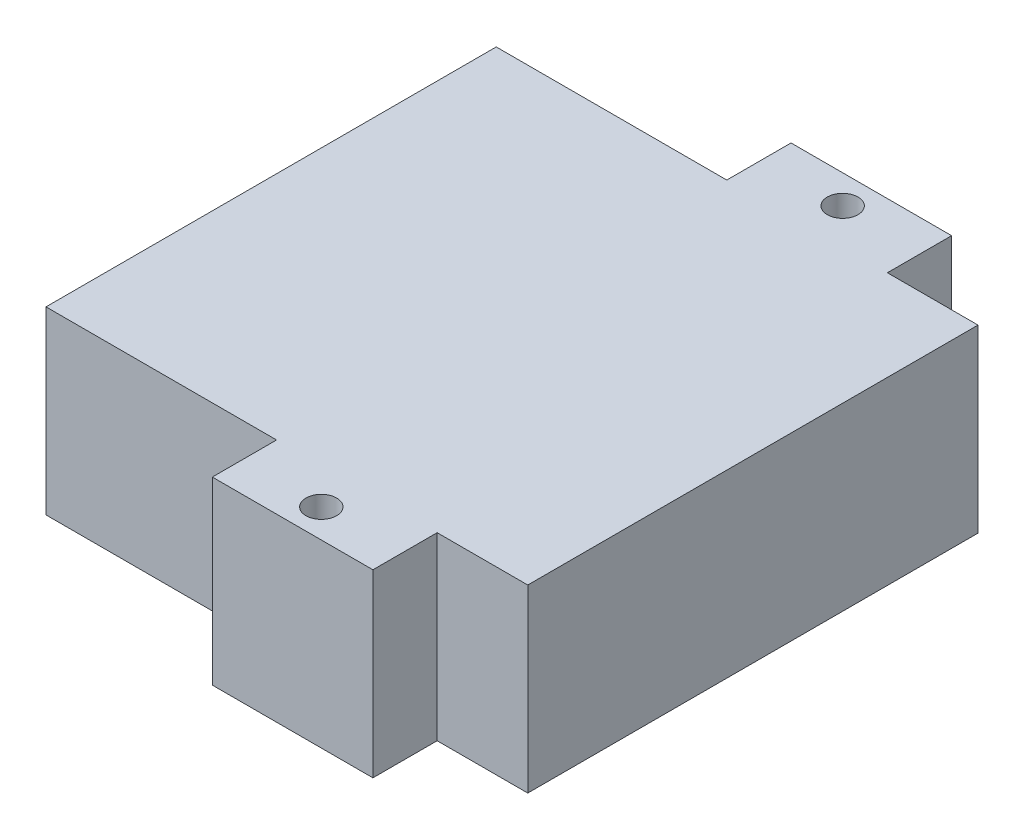
ISO-10303-21;
HEADER;
FILE_DESCRIPTION(('STEP AP214'),'2;1');
FILE_NAME('part.step','',(''),(''),'','','');
FILE_SCHEMA(('AUTOMOTIVE_DESIGN { 1 0 10303 214 1 1 1 1 }'));
ENDSEC;
DATA;
#1=APPLICATION_CONTEXT('core data for automotive mechanical design processes');
#2=APPLICATION_PROTOCOL_DEFINITION('international standard','automotive_design',2000,#1);
#3=PRODUCT_CONTEXT('',#1,'mechanical');
#4=PRODUCT('Part','Part','',(#3));
#5=PRODUCT_RELATED_PRODUCT_CATEGORY('part','',(#4));
#6=PRODUCT_DEFINITION_FORMATION('','',#4);
#7=PRODUCT_DEFINITION_CONTEXT('part definition',#1,'design');
#8=PRODUCT_DEFINITION('design','',#6,#7);
#9=PRODUCT_DEFINITION_SHAPE('','',#8);
#10=(LENGTH_UNIT() NAMED_UNIT(*) SI_UNIT(.MILLI.,.METRE.));
#11=(NAMED_UNIT(*) PLANE_ANGLE_UNIT() SI_UNIT($,.RADIAN.));
#12=(NAMED_UNIT(*) SI_UNIT($,.STERADIAN.) SOLID_ANGLE_UNIT());
#13=UNCERTAINTY_MEASURE_WITH_UNIT(LENGTH_MEASURE(1.E-05),#10,'distance_accuracy_value','');
#14=(GEOMETRIC_REPRESENTATION_CONTEXT(3) GLOBAL_UNCERTAINTY_ASSIGNED_CONTEXT((#13)) GLOBAL_UNIT_ASSIGNED_CONTEXT((#10,
#11,#12)) REPRESENTATION_CONTEXT('',''));
#15=CARTESIAN_POINT('',(0.,0.,0.));
#16=DIRECTION('',(0.,0.,1.));
#17=DIRECTION('',(1.,0.,0.));
#18=AXIS2_PLACEMENT_3D('',#15,#16,#17);
#19=CARTESIAN_POINT('',(0.,0.,0.));
#20=DIRECTION('',(0.,-1.,0.));
#21=DIRECTION('',(0.,0.,-1.));
#22=AXIS2_PLACEMENT_3D('',#19,#20,#21);
#23=PLANE('',#22);
#24=CARTESIAN_POINT('',(7.747,0.,-28.86075));
#25=DIRECTION('',(0.,1.,0.));
#26=DIRECTION('',(0.,0.,1.));
#27=AXIS2_PLACEMENT_3D('',#24,#25,#26);
#28=CIRCLE('',#27,1.69999999999999);
#29=CARTESIAN_POINT('',(7.747,0.,-27.16075));
#30=VERTEX_POINT('',#29);
#31=EDGE_CURVE('E280',#30,#30,#28,.T.);
#32=ORIENTED_EDGE('',*,*,#31,.T.);
#33=EDGE_LOOP('',(#32));
#34=FACE_BOUND('',#33,.T.);
#35=DIRECTION('',(0.,0.,-1.));
#36=VECTOR('',#35,1.);
#37=CARTESIAN_POINT('',(26.67,0.,24.92375));
#38=LINE('',#37,#36);
#39=CARTESIAN_POINT('',(26.67,0.,24.92375));
#40=VERTEX_POINT('',#39);
#41=CARTESIAN_POINT('',(26.67,0.,-24.92375));
#42=VERTEX_POINT('',#41);
#43=EDGE_CURVE('E160',#40,#42,#38,.T.);
#44=ORIENTED_EDGE('',*,*,#43,.F.);
#45=DIRECTION('',(1.,0.,0.));
#46=VECTOR('',#45,1.);
#47=CARTESIAN_POINT('',(16.637,0.,24.92375));
#48=LINE('',#47,#46);
#49=CARTESIAN_POINT('',(16.637,0.,24.92375));
#50=VERTEX_POINT('',#49);
#51=EDGE_CURVE('E103',#50,#40,#48,.T.);
#52=ORIENTED_EDGE('',*,*,#51,.F.);
#53=DIRECTION('',(0.,0.,-1.));
#54=VECTOR('',#53,1.);
#55=CARTESIAN_POINT('',(16.637,0.,24.92375));
#56=LINE('',#55,#54);
#57=CARTESIAN_POINT('',(16.637,0.,32.03575));
#58=VERTEX_POINT('',#57);
#59=EDGE_CURVE('E97',#58,#50,#56,.T.);
#60=ORIENTED_EDGE('',*,*,#59,.F.);
#61=DIRECTION('',(1.,0.,0.));
#62=VECTOR('',#61,1.);
#63=CARTESIAN_POINT('',(-1.14299999999999,0.,32.03575));
#64=LINE('',#63,#62);
#65=CARTESIAN_POINT('',(-1.14299999999999,0.,32.03575));
#66=VERTEX_POINT('',#65);
#67=EDGE_CURVE('E150',#66,#58,#64,.T.);
#68=ORIENTED_EDGE('',*,*,#67,.F.);
#69=DIRECTION('',(0.,0.,1.));
#70=VECTOR('',#69,1.);
#71=CARTESIAN_POINT('',(-1.14299999999999,0.,24.92375));
#72=LINE('',#71,#70);
#73=CARTESIAN_POINT('',(-1.14299999999999,0.,24.92375));
#74=VERTEX_POINT('',#73);
#75=EDGE_CURVE('E178',#74,#66,#72,.T.);
#76=ORIENTED_EDGE('',*,*,#75,.F.);
#77=DIRECTION('',(1.,0.,0.));
#78=VECTOR('',#77,1.);
#79=CARTESIAN_POINT('',(-26.67,0.,24.92375));
#80=LINE('',#79,#78);
#81=CARTESIAN_POINT('',(-26.67,0.,24.92375));
#82=VERTEX_POINT('',#81);
#83=EDGE_CURVE('E176',#82,#74,#80,.T.);
#84=ORIENTED_EDGE('',*,*,#83,.F.);
#85=DIRECTION('',(0.,0.,1.));
#86=VECTOR('',#85,1.);
#87=CARTESIAN_POINT('',(-26.67,0.,24.92375));
#88=LINE('',#87,#86);
#89=CARTESIAN_POINT('',(-26.67,0.,-24.92375));
#90=VERTEX_POINT('',#89);
#91=EDGE_CURVE('E174',#90,#82,#88,.T.);
#92=ORIENTED_EDGE('',*,*,#91,.F.);
#93=DIRECTION('',(-1.,0.,0.));
#94=VECTOR('',#93,1.);
#95=CARTESIAN_POINT('',(-26.67,0.,-24.92375));
#96=LINE('',#95,#94);
#97=CARTESIAN_POINT('',(-1.14299999999999,0.,-24.92375));
#98=VERTEX_POINT('',#97);
#99=EDGE_CURVE('E172',#98,#90,#96,.T.);
#100=ORIENTED_EDGE('',*,*,#99,.F.);
#101=DIRECTION('',(0.,0.,1.));
#102=VECTOR('',#101,1.);
#103=CARTESIAN_POINT('',(-1.14299999999999,0.,-24.92375));
#104=LINE('',#103,#102);
#105=CARTESIAN_POINT('',(-1.14299999999999,0.,-32.03575));
#106=VERTEX_POINT('',#105);
#107=EDGE_CURVE('E170',#106,#98,#104,.T.);
#108=ORIENTED_EDGE('',*,*,#107,.F.);
#109=DIRECTION('',(-1.,0.,0.));
#110=VECTOR('',#109,1.);
#111=CARTESIAN_POINT('',(-1.14299999999999,0.,-32.03575));
#112=LINE('',#111,#110);
#113=CARTESIAN_POINT('',(16.637,0.,-32.03575));
#114=VERTEX_POINT('',#113);
#115=EDGE_CURVE('E168',#114,#106,#112,.T.);
#116=ORIENTED_EDGE('',*,*,#115,.F.);
#117=DIRECTION('',(0.,0.,-1.));
#118=VECTOR('',#117,1.);
#119=CARTESIAN_POINT('',(16.637,0.,-24.92375));
#120=LINE('',#119,#118);
#121=CARTESIAN_POINT('',(16.637,0.,-24.92375));
#122=VERTEX_POINT('',#121);
#123=EDGE_CURVE('E166',#122,#114,#120,.T.);
#124=ORIENTED_EDGE('',*,*,#123,.F.);
#125=DIRECTION('',(-1.,0.,0.));
#126=VECTOR('',#125,1.);
#127=CARTESIAN_POINT('',(16.637,0.,-24.92375));
#128=LINE('',#127,#126);
#129=EDGE_CURVE('E163',#42,#122,#128,.T.);
#130=ORIENTED_EDGE('',*,*,#129,.F.);
#131=EDGE_LOOP('',(#44,#52,#60,#68,#76,#84,#92,#100,#108,#116,#124,#130));
#132=FACE_BOUND('',#131,.T.);
#133=CARTESIAN_POINT('',(7.74700000000001,0.,28.86075));
#134=DIRECTION('',(0.,1.,0.));
#135=DIRECTION('',(0.,0.,1.));
#136=AXIS2_PLACEMENT_3D('',#133,#134,#135);
#137=CIRCLE('',#136,1.69999999999999);
#138=CARTESIAN_POINT('',(7.74700000000001,0.,30.56075));
#139=VERTEX_POINT('',#138);
#140=EDGE_CURVE('E164',#139,#139,#137,.T.);
#141=ORIENTED_EDGE('',*,*,#140,.T.);
#142=EDGE_LOOP('',(#141));
#143=FACE_BOUND('',#142,.T.);
#144=ADVANCED_FACE('F39',(#34,#132,#143),#23,.T.);
#145=CARTESIAN_POINT('',(26.67,19.9517,24.92375));
#146=DIRECTION('',(-1.,0.,0.));
#147=DIRECTION('',(0.,0.,1.));
#148=AXIS2_PLACEMENT_3D('',#145,#146,#147);
#149=PLANE('',#148);
#150=ORIENTED_EDGE('',*,*,#43,.T.);
#151=DIRECTION('',(0.,-1.,0.));
#152=VECTOR('',#151,1.);
#153=CARTESIAN_POINT('',(26.67,19.9517,-24.92375));
#154=LINE('',#153,#152);
#155=CARTESIAN_POINT('',(26.67,19.9517,-24.92375));
#156=VERTEX_POINT('',#155);
#157=EDGE_CURVE('E11',#156,#42,#154,.T.);
#158=ORIENTED_EDGE('',*,*,#157,.F.);
#159=DIRECTION('',(0.,0.,-1.));
#160=VECTOR('',#159,1.);
#161=CARTESIAN_POINT('',(26.67,19.9517,24.92375));
#162=LINE('',#161,#160);
#163=CARTESIAN_POINT('',(26.67,19.9517,24.92375));
#164=VERTEX_POINT('',#163);
#165=EDGE_CURVE('E183',#164,#156,#162,.T.);
#166=ORIENTED_EDGE('',*,*,#165,.F.);
#167=DIRECTION('',(0.,-1.,0.));
#168=VECTOR('',#167,1.);
#169=CARTESIAN_POINT('',(26.67,19.9517,24.92375));
#170=LINE('',#169,#168);
#171=EDGE_CURVE('E156',#164,#40,#170,.T.);
#172=ORIENTED_EDGE('',*,*,#171,.T.);
#173=EDGE_LOOP('',(#150,#158,#166,#172));
#174=FACE_BOUND('',#173,.T.);
#175=ADVANCED_FACE('F41',(#174),#149,.F.);
#176=CARTESIAN_POINT('',(16.637,19.9517,-24.92375));
#177=DIRECTION('',(0.,0.,1.));
#178=DIRECTION('',(1.,0.,0.));
#179=AXIS2_PLACEMENT_3D('',#176,#177,#178);
#180=PLANE('',#179);
#181=ORIENTED_EDGE('',*,*,#129,.T.);
#182=DIRECTION('',(0.,-1.,0.));
#183=VECTOR('',#182,1.);
#184=CARTESIAN_POINT('',(16.637,19.9517,-24.92375));
#185=LINE('',#184,#183);
#186=CARTESIAN_POINT('',(16.637,19.9517,-24.92375));
#187=VERTEX_POINT('',#186);
#188=EDGE_CURVE('E48',#187,#122,#185,.T.);
#189=ORIENTED_EDGE('',*,*,#188,.F.);
#190=DIRECTION('',(-1.,0.,0.));
#191=VECTOR('',#190,1.);
#192=CARTESIAN_POINT('',(16.637,19.9517,-24.92375));
#193=LINE('',#192,#191);
#194=EDGE_CURVE('E111',#156,#187,#193,.T.);
#195=ORIENTED_EDGE('',*,*,#194,.F.);
#196=ORIENTED_EDGE('',*,*,#157,.T.);
#197=EDGE_LOOP('',(#181,#189,#195,#196));
#198=FACE_BOUND('',#197,.T.);
#199=ADVANCED_FACE('F267',(#198),#180,.F.);
#200=CARTESIAN_POINT('',(16.637,19.9517,-24.92375));
#201=DIRECTION('',(-1.,0.,0.));
#202=DIRECTION('',(0.,0.,1.));
#203=AXIS2_PLACEMENT_3D('',#200,#201,#202);
#204=PLANE('',#203);
#205=ORIENTED_EDGE('',*,*,#123,.T.);
#206=DIRECTION('',(0.,-1.,0.));
#207=VECTOR('',#206,1.);
#208=CARTESIAN_POINT('',(16.637,19.9517,-32.03575));
#209=LINE('',#208,#207);
#210=CARTESIAN_POINT('',(16.637,19.9517,-32.03575));
#211=VERTEX_POINT('',#210);
#212=EDGE_CURVE('E202',#211,#114,#209,.T.);
#213=ORIENTED_EDGE('',*,*,#212,.F.);
#214=DIRECTION('',(0.,0.,-1.));
#215=VECTOR('',#214,1.);
#216=CARTESIAN_POINT('',(16.637,19.9517,-24.92375));
#217=LINE('',#216,#215);
#218=EDGE_CURVE('E210',#187,#211,#217,.T.);
#219=ORIENTED_EDGE('',*,*,#218,.F.);
#220=ORIENTED_EDGE('',*,*,#188,.T.);
#221=EDGE_LOOP('',(#205,#213,#219,#220));
#222=FACE_BOUND('',#221,.T.);
#223=ADVANCED_FACE('F208',(#222),#204,.F.);
#224=CARTESIAN_POINT('',(-1.14299999999999,19.9517,-32.03575));
#225=DIRECTION('',(0.,0.,1.));
#226=DIRECTION('',(1.,0.,0.));
#227=AXIS2_PLACEMENT_3D('',#224,#225,#226);
#228=PLANE('',#227);
#229=ORIENTED_EDGE('',*,*,#115,.T.);
#230=DIRECTION('',(0.,-1.,0.));
#231=VECTOR('',#230,1.);
#232=CARTESIAN_POINT('',(-1.14299999999999,19.9517,-32.03575));
#233=LINE('',#232,#231);
#234=CARTESIAN_POINT('',(-1.14299999999999,19.9517,-32.03575));
#235=VERTEX_POINT('',#234);
#236=EDGE_CURVE('E199',#235,#106,#233,.T.);
#237=ORIENTED_EDGE('',*,*,#236,.F.);
#238=DIRECTION('',(-1.,0.,0.));
#239=VECTOR('',#238,1.);
#240=CARTESIAN_POINT('',(-1.14299999999999,19.9517,-32.03575));
#241=LINE('',#240,#239);
#242=EDGE_CURVE('E228',#211,#235,#241,.T.);
#243=ORIENTED_EDGE('',*,*,#242,.F.);
#244=ORIENTED_EDGE('',*,*,#212,.T.);
#245=EDGE_LOOP('',(#229,#237,#243,#244));
#246=FACE_BOUND('',#245,.T.);
#247=ADVANCED_FACE('F219',(#246),#228,.F.);
#248=CARTESIAN_POINT('',(-1.14299999999999,19.9517,-24.92375));
#249=DIRECTION('',(1.,0.,0.));
#250=DIRECTION('',(0.,0.,-1.));
#251=AXIS2_PLACEMENT_3D('',#248,#249,#250);
#252=PLANE('',#251);
#253=ORIENTED_EDGE('',*,*,#107,.T.);
#254=DIRECTION('',(0.,-1.,0.));
#255=VECTOR('',#254,1.);
#256=CARTESIAN_POINT('',(-1.14299999999999,19.9517,-24.92375));
#257=LINE('',#256,#255);
#258=CARTESIAN_POINT('',(-1.14299999999999,19.9517,-24.92375));
#259=VERTEX_POINT('',#258);
#260=EDGE_CURVE('E196',#259,#98,#257,.T.);
#261=ORIENTED_EDGE('',*,*,#260,.F.);
#262=DIRECTION('',(0.,0.,1.));
#263=VECTOR('',#262,1.);
#264=CARTESIAN_POINT('',(-1.14299999999999,19.9517,-24.92375));
#265=LINE('',#264,#263);
#266=EDGE_CURVE('E225',#235,#259,#265,.T.);
#267=ORIENTED_EDGE('',*,*,#266,.F.);
#268=ORIENTED_EDGE('',*,*,#236,.T.);
#269=EDGE_LOOP('',(#253,#261,#267,#268));
#270=FACE_BOUND('',#269,.T.);
#271=ADVANCED_FACE('F223',(#270),#252,.F.);
#272=CARTESIAN_POINT('',(-26.67,19.9517,-24.92375));
#273=DIRECTION('',(0.,0.,1.));
#274=DIRECTION('',(1.,0.,0.));
#275=AXIS2_PLACEMENT_3D('',#272,#273,#274);
#276=PLANE('',#275);
#277=ORIENTED_EDGE('',*,*,#99,.T.);
#278=DIRECTION('',(0.,-1.,0.));
#279=VECTOR('',#278,1.);
#280=CARTESIAN_POINT('',(-26.67,19.9517,-24.92375));
#281=LINE('',#280,#279);
#282=CARTESIAN_POINT('',(-26.67,19.9517,-24.92375));
#283=VERTEX_POINT('',#282);
#284=EDGE_CURVE('E193',#283,#90,#281,.T.);
#285=ORIENTED_EDGE('',*,*,#284,.F.);
#286=DIRECTION('',(-1.,0.,0.));
#287=VECTOR('',#286,1.);
#288=CARTESIAN_POINT('',(-26.67,19.9517,-24.92375));
#289=LINE('',#288,#287);
#290=EDGE_CURVE('E227',#259,#283,#289,.T.);
#291=ORIENTED_EDGE('',*,*,#290,.F.);
#292=ORIENTED_EDGE('',*,*,#260,.T.);
#293=EDGE_LOOP('',(#277,#285,#291,#292));
#294=FACE_BOUND('',#293,.T.);
#295=ADVANCED_FACE('F353',(#294),#276,.F.);
#296=CARTESIAN_POINT('',(-26.67,19.9517,24.92375));
#297=DIRECTION('',(1.,0.,0.));
#298=DIRECTION('',(0.,0.,-1.));
#299=AXIS2_PLACEMENT_3D('',#296,#297,#298);
#300=PLANE('',#299);
#301=ORIENTED_EDGE('',*,*,#91,.T.);
#302=DIRECTION('',(0.,-1.,0.));
#303=VECTOR('',#302,1.);
#304=CARTESIAN_POINT('',(-26.67,19.9517,24.92375));
#305=LINE('',#304,#303);
#306=CARTESIAN_POINT('',(-26.67,19.9517,24.92375));
#307=VERTEX_POINT('',#306);
#308=EDGE_CURVE('E190',#307,#82,#305,.T.);
#309=ORIENTED_EDGE('',*,*,#308,.F.);
#310=DIRECTION('',(0.,0.,1.));
#311=VECTOR('',#310,1.);
#312=CARTESIAN_POINT('',(-26.67,19.9517,24.92375));
#313=LINE('',#312,#311);
#314=EDGE_CURVE('E230',#283,#307,#313,.T.);
#315=ORIENTED_EDGE('',*,*,#314,.F.);
#316=ORIENTED_EDGE('',*,*,#284,.T.);
#317=EDGE_LOOP('',(#301,#309,#315,#316));
#318=FACE_BOUND('',#317,.T.);
#319=ADVANCED_FACE('F344',(#318),#300,.F.);
#320=CARTESIAN_POINT('',(-26.67,19.9517,24.92375));
#321=DIRECTION('',(0.,0.,-1.));
#322=DIRECTION('',(-1.,0.,0.));
#323=AXIS2_PLACEMENT_3D('',#320,#321,#322);
#324=PLANE('',#323);
#325=ORIENTED_EDGE('',*,*,#83,.T.);
#326=DIRECTION('',(0.,-1.,0.));
#327=VECTOR('',#326,1.);
#328=CARTESIAN_POINT('',(-1.14299999999999,19.9517,24.92375));
#329=LINE('',#328,#327);
#330=CARTESIAN_POINT('',(-1.14299999999999,19.9517,24.92375));
#331=VERTEX_POINT('',#330);
#332=EDGE_CURVE('E187',#331,#74,#329,.T.);
#333=ORIENTED_EDGE('',*,*,#332,.F.);
#334=DIRECTION('',(1.,0.,0.));
#335=VECTOR('',#334,1.);
#336=CARTESIAN_POINT('',(-26.67,19.9517,24.92375));
#337=LINE('',#336,#335);
#338=EDGE_CURVE('E236',#307,#331,#337,.T.);
#339=ORIENTED_EDGE('',*,*,#338,.F.);
#340=ORIENTED_EDGE('',*,*,#308,.T.);
#341=EDGE_LOOP('',(#325,#333,#339,#340));
#342=FACE_BOUND('',#341,.T.);
#343=ADVANCED_FACE('F242',(#342),#324,.F.);
#344=CARTESIAN_POINT('',(-1.14299999999999,19.9517,24.92375));
#345=DIRECTION('',(1.,0.,0.));
#346=DIRECTION('',(0.,0.,-1.));
#347=AXIS2_PLACEMENT_3D('',#344,#345,#346);
#348=PLANE('',#347);
#349=ORIENTED_EDGE('',*,*,#75,.T.);
#350=DIRECTION('',(0.,-1.,0.));
#351=VECTOR('',#350,1.);
#352=CARTESIAN_POINT('',(-1.14299999999999,19.9517,32.03575));
#353=LINE('',#352,#351);
#354=CARTESIAN_POINT('',(-1.14299999999999,19.9517,32.03575));
#355=VERTEX_POINT('',#354);
#356=EDGE_CURVE('E151',#355,#66,#353,.T.);
#357=ORIENTED_EDGE('',*,*,#356,.F.);
#358=DIRECTION('',(0.,0.,1.));
#359=VECTOR('',#358,1.);
#360=CARTESIAN_POINT('',(-1.14299999999999,19.9517,24.92375));
#361=LINE('',#360,#359);
#362=EDGE_CURVE('E142',#331,#355,#361,.T.);
#363=ORIENTED_EDGE('',*,*,#362,.F.);
#364=ORIENTED_EDGE('',*,*,#332,.T.);
#365=EDGE_LOOP('',(#349,#357,#363,#364));
#366=FACE_BOUND('',#365,.T.);
#367=ADVANCED_FACE('F246',(#366),#348,.F.);
#368=CARTESIAN_POINT('',(-1.14299999999999,19.9517,32.03575));
#369=DIRECTION('',(0.,0.,-1.));
#370=DIRECTION('',(-1.,0.,0.));
#371=AXIS2_PLACEMENT_3D('',#368,#369,#370);
#372=PLANE('',#371);
#373=ORIENTED_EDGE('',*,*,#67,.T.);
#374=DIRECTION('',(0.,-1.,0.));
#375=VECTOR('',#374,1.);
#376=CARTESIAN_POINT('',(16.637,19.9517,32.03575));
#377=LINE('',#376,#375);
#378=CARTESIAN_POINT('',(16.637,19.9517,32.03575));
#379=VERTEX_POINT('',#378);
#380=EDGE_CURVE('E147',#379,#58,#377,.T.);
#381=ORIENTED_EDGE('',*,*,#380,.F.);
#382=DIRECTION('',(1.,0.,0.));
#383=VECTOR('',#382,1.);
#384=CARTESIAN_POINT('',(-1.14299999999999,19.9517,32.03575));
#385=LINE('',#384,#383);
#386=EDGE_CURVE('E136',#355,#379,#385,.T.);
#387=ORIENTED_EDGE('',*,*,#386,.F.);
#388=ORIENTED_EDGE('',*,*,#356,.T.);
#389=EDGE_LOOP('',(#373,#381,#387,#388));
#390=FACE_BOUND('',#389,.T.);
#391=ADVANCED_FACE('F148',(#390),#372,.F.);
#392=CARTESIAN_POINT('',(16.637,19.9517,24.92375));
#393=DIRECTION('',(-1.,0.,0.));
#394=DIRECTION('',(0.,0.,1.));
#395=AXIS2_PLACEMENT_3D('',#392,#393,#394);
#396=PLANE('',#395);
#397=ORIENTED_EDGE('',*,*,#59,.T.);
#398=DIRECTION('',(0.,-1.,0.));
#399=VECTOR('',#398,1.);
#400=CARTESIAN_POINT('',(16.637,19.9517,24.92375));
#401=LINE('',#400,#399);
#402=CARTESIAN_POINT('',(16.637,19.9517,24.92375));
#403=VERTEX_POINT('',#402);
#404=EDGE_CURVE('E152',#403,#50,#401,.T.);
#405=ORIENTED_EDGE('',*,*,#404,.F.);
#406=DIRECTION('',(0.,0.,-1.));
#407=VECTOR('',#406,1.);
#408=CARTESIAN_POINT('',(16.637,19.9517,24.92375));
#409=LINE('',#408,#407);
#410=EDGE_CURVE('E140',#379,#403,#409,.T.);
#411=ORIENTED_EDGE('',*,*,#410,.F.);
#412=ORIENTED_EDGE('',*,*,#380,.T.);
#413=EDGE_LOOP('',(#397,#405,#411,#412));
#414=FACE_BOUND('',#413,.T.);
#415=ADVANCED_FACE('F154',(#414),#396,.F.);
#416=CARTESIAN_POINT('',(16.637,19.9517,24.92375));
#417=DIRECTION('',(0.,0.,-1.));
#418=DIRECTION('',(-1.,0.,0.));
#419=AXIS2_PLACEMENT_3D('',#416,#417,#418);
#420=PLANE('',#419);
#421=ORIENTED_EDGE('',*,*,#51,.T.);
#422=ORIENTED_EDGE('',*,*,#171,.F.);
#423=DIRECTION('',(1.,0.,0.));
#424=VECTOR('',#423,1.);
#425=CARTESIAN_POINT('',(16.637,19.9517,24.92375));
#426=LINE('',#425,#424);
#427=EDGE_CURVE('E56',#403,#164,#426,.T.);
#428=ORIENTED_EDGE('',*,*,#427,.F.);
#429=ORIENTED_EDGE('',*,*,#404,.T.);
#430=EDGE_LOOP('',(#421,#422,#428,#429));
#431=FACE_BOUND('',#430,.T.);
#432=ADVANCED_FACE('F250',(#431),#420,.F.);
#433=CARTESIAN_POINT('',(0.,19.9517,0.));
#434=DIRECTION('',(0.,-1.,0.));
#435=DIRECTION('',(0.,0.,-1.));
#436=AXIS2_PLACEMENT_3D('',#433,#434,#435);
#437=PLANE('',#436);
#438=CARTESIAN_POINT('',(7.747,19.9517,-28.86075));
#439=DIRECTION('',(0.,1.,0.));
#440=DIRECTION('',(0.,0.,1.));
#441=AXIS2_PLACEMENT_3D('',#438,#439,#440);
#442=CIRCLE('',#441,1.69999999999999);
#443=CARTESIAN_POINT('',(7.747,19.9517,-27.16075));
#444=VERTEX_POINT('',#443);
#445=EDGE_CURVE('E283',#444,#444,#442,.T.);
#446=ORIENTED_EDGE('',*,*,#445,.F.);
#447=EDGE_LOOP('',(#446));
#448=FACE_BOUND('',#447,.T.);
#449=CARTESIAN_POINT('',(7.74700000000001,19.9517,28.86075));
#450=DIRECTION('',(0.,1.,0.));
#451=DIRECTION('',(0.,0.,1.));
#452=AXIS2_PLACEMENT_3D('',#449,#450,#451);
#453=CIRCLE('',#452,1.69999999999999);
#454=CARTESIAN_POINT('',(7.74700000000001,19.9517,30.56075));
#455=VERTEX_POINT('',#454);
#456=EDGE_CURVE('E285',#455,#455,#453,.T.);
#457=ORIENTED_EDGE('',*,*,#456,.F.);
#458=EDGE_LOOP('',(#457));
#459=FACE_BOUND('',#458,.T.);
#460=ORIENTED_EDGE('',*,*,#165,.T.);
#461=ORIENTED_EDGE('',*,*,#194,.T.);
#462=ORIENTED_EDGE('',*,*,#218,.T.);
#463=ORIENTED_EDGE('',*,*,#242,.T.);
#464=ORIENTED_EDGE('',*,*,#266,.T.);
#465=ORIENTED_EDGE('',*,*,#290,.T.);
#466=ORIENTED_EDGE('',*,*,#314,.T.);
#467=ORIENTED_EDGE('',*,*,#338,.T.);
#468=ORIENTED_EDGE('',*,*,#362,.T.);
#469=ORIENTED_EDGE('',*,*,#386,.T.);
#470=ORIENTED_EDGE('',*,*,#410,.T.);
#471=ORIENTED_EDGE('',*,*,#427,.T.);
#472=EDGE_LOOP('',(#460,#461,#462,#463,#464,#465,#466,#467,#468,#469,#470,#471));
#473=FACE_BOUND('',#472,.T.);
#474=ADVANCED_FACE('F138',(#448,#459,#473),#437,.F.);
#475=CARTESIAN_POINT('',(7.74700000000001,19.9517,28.86075));
#476=DIRECTION('',(0.,1.,0.));
#477=DIRECTION('',(0.,0.,1.));
#478=AXIS2_PLACEMENT_3D('',#475,#476,#477);
#479=CYLINDRICAL_SURFACE('',#478,1.69999999999999);
#480=ORIENTED_EDGE('',*,*,#140,.F.);
#481=EDGE_LOOP('',(#480));
#482=FACE_BOUND('',#481,.T.);
#483=ORIENTED_EDGE('',*,*,#456,.T.);
#484=EDGE_LOOP('',(#483));
#485=FACE_BOUND('',#484,.T.);
#486=ADVANCED_FACE('F257',(#482,#485),#479,.F.);
#487=CARTESIAN_POINT('',(7.747,19.9517,-28.86075));
#488=DIRECTION('',(0.,1.,0.));
#489=DIRECTION('',(0.,0.,1.));
#490=AXIS2_PLACEMENT_3D('',#487,#488,#489);
#491=CYLINDRICAL_SURFACE('',#490,1.69999999999999);
#492=ORIENTED_EDGE('',*,*,#31,.F.);
#493=EDGE_LOOP('',(#492));
#494=FACE_BOUND('',#493,.T.);
#495=ORIENTED_EDGE('',*,*,#445,.T.);
#496=EDGE_LOOP('',(#495));
#497=FACE_BOUND('',#496,.T.);
#498=ADVANCED_FACE('F272',(#494,#497),#491,.F.);
#499=CLOSED_SHELL('',(#144,#175,#199,#223,#247,#271,#295,#319,#343,#367,#391,#415,#432,#474,
#486,#498));
#500=MANIFOLD_SOLID_BREP('B2',#499);
#501=ADVANCED_BREP_SHAPE_REPRESENTATION('',(#18,#500),#14);
#502=SHAPE_DEFINITION_REPRESENTATION(#9,#501);
ENDSEC;
END-ISO-10303-21;
